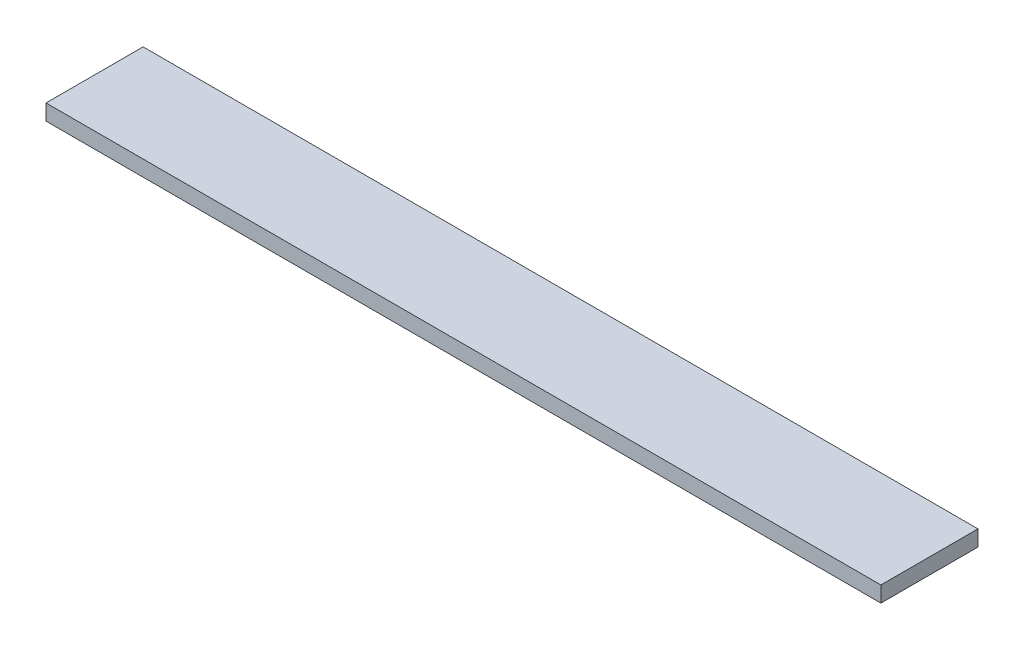
ISO-10303-21;
HEADER;
FILE_DESCRIPTION(('STEP AP214'),'2;1');
FILE_NAME('part.step','',(''),(''),'','','');
FILE_SCHEMA(('AUTOMOTIVE_DESIGN { 1 0 10303 214 1 1 1 1 }'));
ENDSEC;
DATA;
#1=APPLICATION_CONTEXT('core data for automotive mechanical design processes');
#2=APPLICATION_PROTOCOL_DEFINITION('international standard','automotive_design',2000,#1);
#3=PRODUCT_CONTEXT('',#1,'mechanical');
#4=PRODUCT('Part','Part','',(#3));
#5=PRODUCT_RELATED_PRODUCT_CATEGORY('part','',(#4));
#6=PRODUCT_DEFINITION_FORMATION('','',#4);
#7=PRODUCT_DEFINITION_CONTEXT('part definition',#1,'design');
#8=PRODUCT_DEFINITION('design','',#6,#7);
#9=PRODUCT_DEFINITION_SHAPE('','',#8);
#10=(LENGTH_UNIT() NAMED_UNIT(*) SI_UNIT(.MILLI.,.METRE.));
#11=(NAMED_UNIT(*) PLANE_ANGLE_UNIT() SI_UNIT($,.RADIAN.));
#12=(NAMED_UNIT(*) SI_UNIT($,.STERADIAN.) SOLID_ANGLE_UNIT());
#13=UNCERTAINTY_MEASURE_WITH_UNIT(LENGTH_MEASURE(1.E-05),#10,'distance_accuracy_value','');
#14=(GEOMETRIC_REPRESENTATION_CONTEXT(3) GLOBAL_UNCERTAINTY_ASSIGNED_CONTEXT((#13)) GLOBAL_UNIT_ASSIGNED_CONTEXT((#10,
#11,#12)) REPRESENTATION_CONTEXT('',''));
#15=CARTESIAN_POINT('',(0.,0.,0.));
#16=DIRECTION('',(0.,0.,1.));
#17=DIRECTION('',(1.,0.,0.));
#18=AXIS2_PLACEMENT_3D('',#15,#16,#17);
#19=CARTESIAN_POINT('',(-11516.3203125,38.1,-5174.45625000001));
#20=DIRECTION('',(1.,0.,0.));
#21=DIRECTION('',(0.,0.,-1.));
#22=AXIS2_PLACEMENT_3D('',#19,#20,#21);
#23=PLANE('',#22);
#24=DIRECTION('',(0.,0.,1.));
#25=VECTOR('',#24,1.);
#26=CARTESIAN_POINT('',(-11516.3203125,0.,-5174.45625000001));
#27=LINE('',#26,#25);
#28=CARTESIAN_POINT('',(-11516.3203125,0.,-5174.45625000001));
#29=VERTEX_POINT('',#28);
#30=CARTESIAN_POINT('',(-11516.3203125,0.,-4939.50625000001));
#31=VERTEX_POINT('',#30);
#32=EDGE_CURVE('E96',#29,#31,#27,.T.);
#33=ORIENTED_EDGE('',*,*,#32,.T.);
#34=DIRECTION('',(0.,-1.,0.));
#35=VECTOR('',#34,1.);
#36=CARTESIAN_POINT('',(-11516.3203125,38.1,-4939.50625000001));
#37=LINE('',#36,#35);
#38=CARTESIAN_POINT('',(-11516.3203125,38.1,-4939.50625000001));
#39=VERTEX_POINT('',#38);
#40=EDGE_CURVE('E11',#39,#31,#37,.T.);
#41=ORIENTED_EDGE('',*,*,#40,.F.);
#42=DIRECTION('',(0.,0.,1.));
#43=VECTOR('',#42,1.);
#44=CARTESIAN_POINT('',(-11516.3203125,38.1,-5174.45625000001));
#45=LINE('',#44,#43);
#46=CARTESIAN_POINT('',(-11516.3203125,38.1,-5174.45625000001));
#47=VERTEX_POINT('',#46);
#48=EDGE_CURVE('E84',#47,#39,#45,.T.);
#49=ORIENTED_EDGE('',*,*,#48,.F.);
#50=DIRECTION('',(0.,-1.,0.));
#51=VECTOR('',#50,1.);
#52=CARTESIAN_POINT('',(-11516.3203125,38.1,-5174.45625000001));
#53=LINE('',#52,#51);
#54=EDGE_CURVE('E92',#47,#29,#53,.T.);
#55=ORIENTED_EDGE('',*,*,#54,.T.);
#56=EDGE_LOOP('',(#33,#41,#49,#55));
#57=FACE_BOUND('',#56,.T.);
#58=ADVANCED_FACE('F33',(#57),#23,.F.);
#59=CARTESIAN_POINT('',(-11516.3203125,38.1,-4939.50625000001));
#60=DIRECTION('',(0.,0.,-1.));
#61=DIRECTION('',(-1.,0.,0.));
#62=AXIS2_PLACEMENT_3D('',#59,#60,#61);
#63=PLANE('',#62);
#64=DIRECTION('',(1.,0.,0.));
#65=VECTOR('',#64,1.);
#66=CARTESIAN_POINT('',(-11516.3203125,0.,-4939.50625000001));
#67=LINE('',#66,#65);
#68=CARTESIAN_POINT('',(-9497.02031250001,0.,-4939.50625000001));
#69=VERTEX_POINT('',#68);
#70=EDGE_CURVE('E88',#31,#69,#67,.T.);
#71=ORIENTED_EDGE('',*,*,#70,.T.);
#72=DIRECTION('',(0.,-1.,0.));
#73=VECTOR('',#72,1.);
#74=CARTESIAN_POINT('',(-9497.02031250001,38.1,-4939.50625000001));
#75=LINE('',#74,#73);
#76=CARTESIAN_POINT('',(-9497.02031250001,38.1,-4939.50625000001));
#77=VERTEX_POINT('',#76);
#78=EDGE_CURVE('E41',#77,#69,#75,.T.);
#79=ORIENTED_EDGE('',*,*,#78,.F.);
#80=DIRECTION('',(1.,0.,0.));
#81=VECTOR('',#80,1.);
#82=CARTESIAN_POINT('',(-11516.3203125,38.1,-4939.50625000001));
#83=LINE('',#82,#81);
#84=EDGE_CURVE('E79',#39,#77,#83,.T.);
#85=ORIENTED_EDGE('',*,*,#84,.F.);
#86=ORIENTED_EDGE('',*,*,#40,.T.);
#87=EDGE_LOOP('',(#71,#79,#85,#86));
#88=FACE_BOUND('',#87,.T.);
#89=ADVANCED_FACE('F87',(#88),#63,.F.);
#90=CARTESIAN_POINT('',(-9497.02031250001,38.1,-5174.45625000001));
#91=DIRECTION('',(-1.,0.,0.));
#92=DIRECTION('',(0.,0.,1.));
#93=AXIS2_PLACEMENT_3D('',#90,#91,#92);
#94=PLANE('',#93);
#95=DIRECTION('',(0.,0.,-1.));
#96=VECTOR('',#95,1.);
#97=CARTESIAN_POINT('',(-9497.02031250001,0.,-5174.45625000001));
#98=LINE('',#97,#96);
#99=CARTESIAN_POINT('',(-9497.02031250001,0.,-5174.45625000001));
#100=VERTEX_POINT('',#99);
#101=EDGE_CURVE('E66',#69,#100,#98,.T.);
#102=ORIENTED_EDGE('',*,*,#101,.T.);
#103=DIRECTION('',(0.,-1.,0.));
#104=VECTOR('',#103,1.);
#105=CARTESIAN_POINT('',(-9497.02031250001,38.1,-5174.45625000001));
#106=LINE('',#105,#104);
#107=CARTESIAN_POINT('',(-9497.02031250001,38.1,-5174.45625000001));
#108=VERTEX_POINT('',#107);
#109=EDGE_CURVE('E89',#108,#100,#106,.T.);
#110=ORIENTED_EDGE('',*,*,#109,.F.);
#111=DIRECTION('',(0.,0.,-1.));
#112=VECTOR('',#111,1.);
#113=CARTESIAN_POINT('',(-9497.02031250001,38.1,-5174.45625000001));
#114=LINE('',#113,#112);
#115=EDGE_CURVE('E82',#77,#108,#114,.T.);
#116=ORIENTED_EDGE('',*,*,#115,.F.);
#117=ORIENTED_EDGE('',*,*,#78,.T.);
#118=EDGE_LOOP('',(#102,#110,#116,#117));
#119=FACE_BOUND('',#118,.T.);
#120=ADVANCED_FACE('F90',(#119),#94,.F.);
#121=CARTESIAN_POINT('',(-11516.3203125,38.1,-5174.45625000001));
#122=DIRECTION('',(0.,0.,1.));
#123=DIRECTION('',(1.,0.,0.));
#124=AXIS2_PLACEMENT_3D('',#121,#122,#123);
#125=PLANE('',#124);
#126=DIRECTION('',(-1.,0.,0.));
#127=VECTOR('',#126,1.);
#128=CARTESIAN_POINT('',(-11516.3203125,0.,-5174.45625000001));
#129=LINE('',#128,#127);
#130=EDGE_CURVE('E72',#100,#29,#129,.T.);
#131=ORIENTED_EDGE('',*,*,#130,.T.);
#132=ORIENTED_EDGE('',*,*,#54,.F.);
#133=DIRECTION('',(-1.,0.,0.));
#134=VECTOR('',#133,1.);
#135=CARTESIAN_POINT('',(-11516.3203125,38.1,-5174.45625000001));
#136=LINE('',#135,#134);
#137=EDGE_CURVE('E49',#108,#47,#136,.T.);
#138=ORIENTED_EDGE('',*,*,#137,.F.);
#139=ORIENTED_EDGE('',*,*,#109,.T.);
#140=EDGE_LOOP('',(#131,#132,#138,#139));
#141=FACE_BOUND('',#140,.T.);
#142=ADVANCED_FACE('F103',(#141),#125,.F.);
#143=CARTESIAN_POINT('',(0.,38.1,0.));
#144=DIRECTION('',(0.,1.,0.));
#145=DIRECTION('',(0.,0.,1.));
#146=AXIS2_PLACEMENT_3D('',#143,#144,#145);
#147=PLANE('',#146);
#148=ORIENTED_EDGE('',*,*,#48,.T.);
#149=ORIENTED_EDGE('',*,*,#84,.T.);
#150=ORIENTED_EDGE('',*,*,#115,.T.);
#151=ORIENTED_EDGE('',*,*,#137,.T.);
#152=EDGE_LOOP('',(#148,#149,#150,#151));
#153=FACE_BOUND('',#152,.T.);
#154=ADVANCED_FACE('F80',(#153),#147,.T.);
#155=CARTESIAN_POINT('',(0.,0.,0.));
#156=DIRECTION('',(0.,1.,0.));
#157=DIRECTION('',(0.,0.,1.));
#158=AXIS2_PLACEMENT_3D('',#155,#156,#157);
#159=PLANE('',#158);
#160=ORIENTED_EDGE('',*,*,#32,.F.);
#161=ORIENTED_EDGE('',*,*,#130,.F.);
#162=ORIENTED_EDGE('',*,*,#101,.F.);
#163=ORIENTED_EDGE('',*,*,#70,.F.);
#164=EDGE_LOOP('',(#160,#161,#162,#163));
#165=FACE_BOUND('',#164,.T.);
#166=ADVANCED_FACE('F106',(#165),#159,.F.);
#167=CLOSED_SHELL('',(#58,#89,#120,#142,#154,#166));
#168=MANIFOLD_SOLID_BREP('B2',#167);
#169=ADVANCED_BREP_SHAPE_REPRESENTATION('',(#18,#168),#14);
#170=SHAPE_DEFINITION_REPRESENTATION(#9,#169);
ENDSEC;
END-ISO-10303-21;
